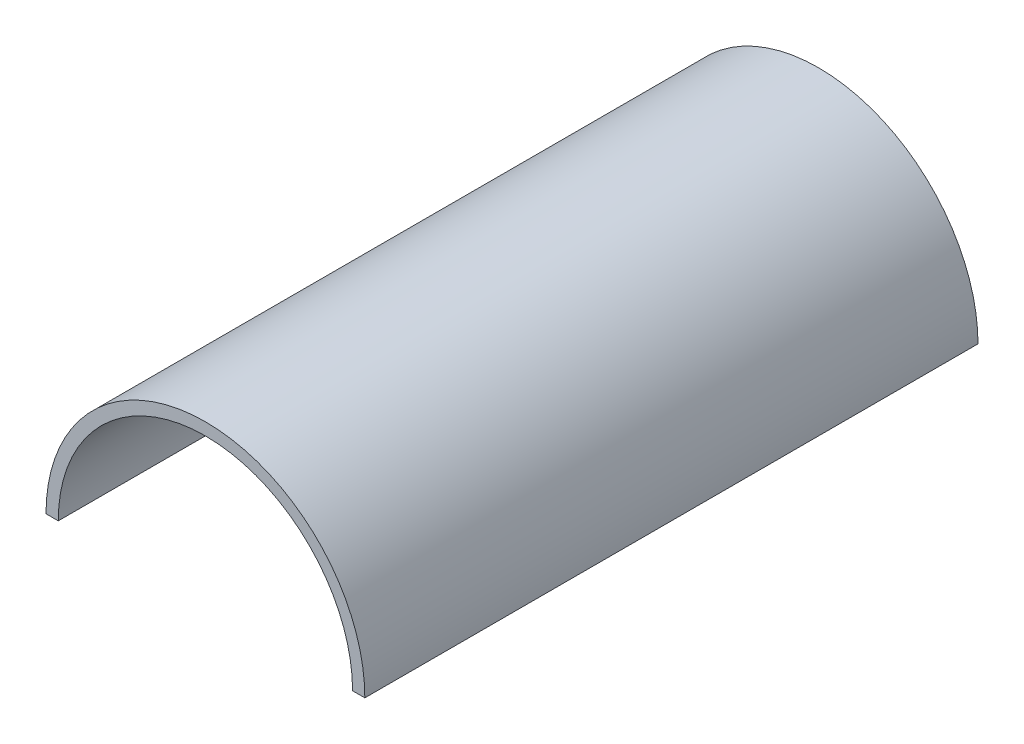
ISO-10303-21;
HEADER;
FILE_DESCRIPTION(('STEP AP214'),'2;1');
FILE_NAME('part.step','',(''),(''),'','','');
FILE_SCHEMA(('AUTOMOTIVE_DESIGN { 1 0 10303 214 1 1 1 1 }'));
ENDSEC;
DATA;
#1=APPLICATION_CONTEXT('core data for automotive mechanical design processes');
#2=APPLICATION_PROTOCOL_DEFINITION('international standard','automotive_design',2000,#1);
#3=PRODUCT_CONTEXT('',#1,'mechanical');
#4=PRODUCT('Part','Part','',(#3));
#5=PRODUCT_RELATED_PRODUCT_CATEGORY('part','',(#4));
#6=PRODUCT_DEFINITION_FORMATION('','',#4);
#7=PRODUCT_DEFINITION_CONTEXT('part definition',#1,'design');
#8=PRODUCT_DEFINITION('design','',#6,#7);
#9=PRODUCT_DEFINITION_SHAPE('','',#8);
#10=(LENGTH_UNIT() NAMED_UNIT(*) SI_UNIT(.MILLI.,.METRE.));
#11=(NAMED_UNIT(*) PLANE_ANGLE_UNIT() SI_UNIT($,.RADIAN.));
#12=(NAMED_UNIT(*) SI_UNIT($,.STERADIAN.) SOLID_ANGLE_UNIT());
#13=UNCERTAINTY_MEASURE_WITH_UNIT(LENGTH_MEASURE(1.E-05),#10,'distance_accuracy_value','');
#14=(GEOMETRIC_REPRESENTATION_CONTEXT(3) GLOBAL_UNCERTAINTY_ASSIGNED_CONTEXT((#13)) GLOBAL_UNIT_ASSIGNED_CONTEXT((#10,
#11,#12)) REPRESENTATION_CONTEXT('',''));
#15=CARTESIAN_POINT('',(0.,0.,0.));
#16=DIRECTION('',(0.,0.,1.));
#17=DIRECTION('',(1.,0.,0.));
#18=AXIS2_PLACEMENT_3D('',#15,#16,#17);
#19=CARTESIAN_POINT('',(0.,0.,100.));
#20=DIRECTION('',(0.,0.,-1.));
#21=DIRECTION('',(-1.,0.,0.));
#22=AXIS2_PLACEMENT_3D('',#19,#20,#21);
#23=CYLINDRICAL_SURFACE('',#22,26.);
#24=CARTESIAN_POINT('',(0.,0.,0.));
#25=DIRECTION('',(0.,0.,1.));
#26=DIRECTION('',(1.,0.,0.));
#27=AXIS2_PLACEMENT_3D('',#24,#25,#26);
#28=CIRCLE('',#27,26.);
#29=CARTESIAN_POINT('',(26.,0.,0.));
#30=VERTEX_POINT('',#29);
#31=CARTESIAN_POINT('',(-26.,0.,0.));
#32=VERTEX_POINT('',#31);
#33=EDGE_CURVE('E77',#30,#32,#28,.T.);
#34=ORIENTED_EDGE('',*,*,#33,.T.);
#35=DIRECTION('',(0.,0.,-1.));
#36=VECTOR('',#35,1.);
#37=CARTESIAN_POINT('',(-26.,0.,100.));
#38=LINE('',#37,#36);
#39=CARTESIAN_POINT('',(-26.,0.,100.));
#40=VERTEX_POINT('',#39);
#41=EDGE_CURVE('E11',#40,#32,#38,.T.);
#42=ORIENTED_EDGE('',*,*,#41,.F.);
#43=CARTESIAN_POINT('',(0.,0.,100.));
#44=DIRECTION('',(0.,0.,1.));
#45=DIRECTION('',(-1.,0.,0.));
#46=AXIS2_PLACEMENT_3D('',#43,#44,#45);
#47=CIRCLE('',#46,26.);
#48=CARTESIAN_POINT('',(26.,0.,100.));
#49=VERTEX_POINT('',#48);
#50=EDGE_CURVE('E82',#49,#40,#47,.T.);
#51=ORIENTED_EDGE('',*,*,#50,.F.);
#52=DIRECTION('',(0.,0.,-1.));
#53=VECTOR('',#52,1.);
#54=CARTESIAN_POINT('',(26.,0.,100.));
#55=LINE('',#54,#53);
#56=EDGE_CURVE('E97',#49,#30,#55,.T.);
#57=ORIENTED_EDGE('',*,*,#56,.T.);
#58=EDGE_LOOP('',(#34,#42,#51,#57));
#59=FACE_BOUND('',#58,.T.);
#60=ADVANCED_FACE('F37',(#59),#23,.T.);
#61=CARTESIAN_POINT('',(-26.,0.,100.));
#62=DIRECTION('',(0.,1.,0.));
#63=DIRECTION('',(0.,0.,1.));
#64=AXIS2_PLACEMENT_3D('',#61,#62,#63);
#65=PLANE('',#64);
#66=DIRECTION('',(1.,0.,0.));
#67=VECTOR('',#66,1.);
#68=CARTESIAN_POINT('',(-26.,0.,0.));
#69=LINE('',#68,#67);
#70=CARTESIAN_POINT('',(-24.,0.,0.));
#71=VERTEX_POINT('',#70);
#72=EDGE_CURVE('E93',#32,#71,#69,.T.);
#73=ORIENTED_EDGE('',*,*,#72,.T.);
#74=DIRECTION('',(0.,0.,-1.));
#75=VECTOR('',#74,1.);
#76=CARTESIAN_POINT('',(-24.,0.,100.));
#77=LINE('',#76,#75);
#78=CARTESIAN_POINT('',(-24.,0.,100.));
#79=VERTEX_POINT('',#78);
#80=EDGE_CURVE('E45',#79,#71,#77,.T.);
#81=ORIENTED_EDGE('',*,*,#80,.F.);
#82=DIRECTION('',(1.,0.,0.));
#83=VECTOR('',#82,1.);
#84=CARTESIAN_POINT('',(-26.,0.,100.));
#85=LINE('',#84,#83);
#86=EDGE_CURVE('E85',#40,#79,#85,.T.);
#87=ORIENTED_EDGE('',*,*,#86,.F.);
#88=ORIENTED_EDGE('',*,*,#41,.T.);
#89=EDGE_LOOP('',(#73,#81,#87,#88));
#90=FACE_BOUND('',#89,.T.);
#91=ADVANCED_FACE('F92',(#90),#65,.F.);
#92=CARTESIAN_POINT('',(0.,0.,100.));
#93=DIRECTION('',(0.,0.,-1.));
#94=DIRECTION('',(-1.,0.,0.));
#95=AXIS2_PLACEMENT_3D('',#92,#93,#94);
#96=CYLINDRICAL_SURFACE('',#95,24.);
#97=CARTESIAN_POINT('',(0.,0.,0.));
#98=DIRECTION('',(0.,0.,-1.));
#99=DIRECTION('',(1.,0.,0.));
#100=AXIS2_PLACEMENT_3D('',#97,#98,#99);
#101=CIRCLE('',#100,24.);
#102=CARTESIAN_POINT('',(24.,0.,0.));
#103=VERTEX_POINT('',#102);
#104=EDGE_CURVE('E70',#71,#103,#101,.T.);
#105=ORIENTED_EDGE('',*,*,#104,.T.);
#106=DIRECTION('',(0.,0.,-1.));
#107=VECTOR('',#106,1.);
#108=CARTESIAN_POINT('',(24.,0.,100.));
#109=LINE('',#108,#107);
#110=CARTESIAN_POINT('',(24.,0.,100.));
#111=VERTEX_POINT('',#110);
#112=EDGE_CURVE('E94',#111,#103,#109,.T.);
#113=ORIENTED_EDGE('',*,*,#112,.F.);
#114=CARTESIAN_POINT('',(0.,0.,100.));
#115=DIRECTION('',(0.,0.,-1.));
#116=DIRECTION('',(1.,0.,0.));
#117=AXIS2_PLACEMENT_3D('',#114,#115,#116);
#118=CIRCLE('',#117,24.);
#119=EDGE_CURVE('E89',#79,#111,#118,.T.);
#120=ORIENTED_EDGE('',*,*,#119,.F.);
#121=ORIENTED_EDGE('',*,*,#80,.T.);
#122=EDGE_LOOP('',(#105,#113,#120,#121));
#123=FACE_BOUND('',#122,.T.);
#124=ADVANCED_FACE('F95',(#123),#96,.F.);
#125=CARTESIAN_POINT('',(24.,0.,100.));
#126=DIRECTION('',(0.,1.,0.));
#127=DIRECTION('',(0.,0.,1.));
#128=AXIS2_PLACEMENT_3D('',#125,#126,#127);
#129=PLANE('',#128);
#130=DIRECTION('',(1.,0.,0.));
#131=VECTOR('',#130,1.);
#132=CARTESIAN_POINT('',(24.,0.,0.));
#133=LINE('',#132,#131);
#134=EDGE_CURVE('E104',#103,#30,#133,.T.);
#135=ORIENTED_EDGE('',*,*,#134,.T.);
#136=ORIENTED_EDGE('',*,*,#56,.F.);
#137=DIRECTION('',(1.,0.,0.));
#138=VECTOR('',#137,1.);
#139=CARTESIAN_POINT('',(24.,0.,100.));
#140=LINE('',#139,#138);
#141=EDGE_CURVE('E53',#111,#49,#140,.T.);
#142=ORIENTED_EDGE('',*,*,#141,.F.);
#143=ORIENTED_EDGE('',*,*,#112,.T.);
#144=EDGE_LOOP('',(#135,#136,#142,#143));
#145=FACE_BOUND('',#144,.T.);
#146=ADVANCED_FACE('F109',(#145),#129,.F.);
#147=CARTESIAN_POINT('',(0.,0.,100.));
#148=DIRECTION('',(0.,0.,-1.));
#149=DIRECTION('',(-1.,0.,0.));
#150=AXIS2_PLACEMENT_3D('',#147,#148,#149);
#151=PLANE('',#150);
#152=ORIENTED_EDGE('',*,*,#50,.T.);
#153=ORIENTED_EDGE('',*,*,#86,.T.);
#154=ORIENTED_EDGE('',*,*,#119,.T.);
#155=ORIENTED_EDGE('',*,*,#141,.T.);
#156=EDGE_LOOP('',(#152,#153,#154,#155));
#157=FACE_BOUND('',#156,.T.);
#158=ADVANCED_FACE('F87',(#157),#151,.F.);
#159=CARTESIAN_POINT('',(0.,0.,0.));
#160=DIRECTION('',(0.,0.,-1.));
#161=DIRECTION('',(-1.,0.,0.));
#162=AXIS2_PLACEMENT_3D('',#159,#160,#161);
#163=PLANE('',#162);
#164=ORIENTED_EDGE('',*,*,#33,.F.);
#165=ORIENTED_EDGE('',*,*,#134,.F.);
#166=ORIENTED_EDGE('',*,*,#104,.F.);
#167=ORIENTED_EDGE('',*,*,#72,.F.);
#168=EDGE_LOOP('',(#164,#165,#166,#167));
#169=FACE_BOUND('',#168,.T.);
#170=ADVANCED_FACE('F110',(#169),#163,.T.);
#171=CLOSED_SHELL('',(#60,#91,#124,#146,#158,#170));
#172=MANIFOLD_SOLID_BREP('B2',#171);
#173=ADVANCED_BREP_SHAPE_REPRESENTATION('',(#18,#172),#14);
#174=SHAPE_DEFINITION_REPRESENTATION(#9,#173);
ENDSEC;
END-ISO-10303-21;
